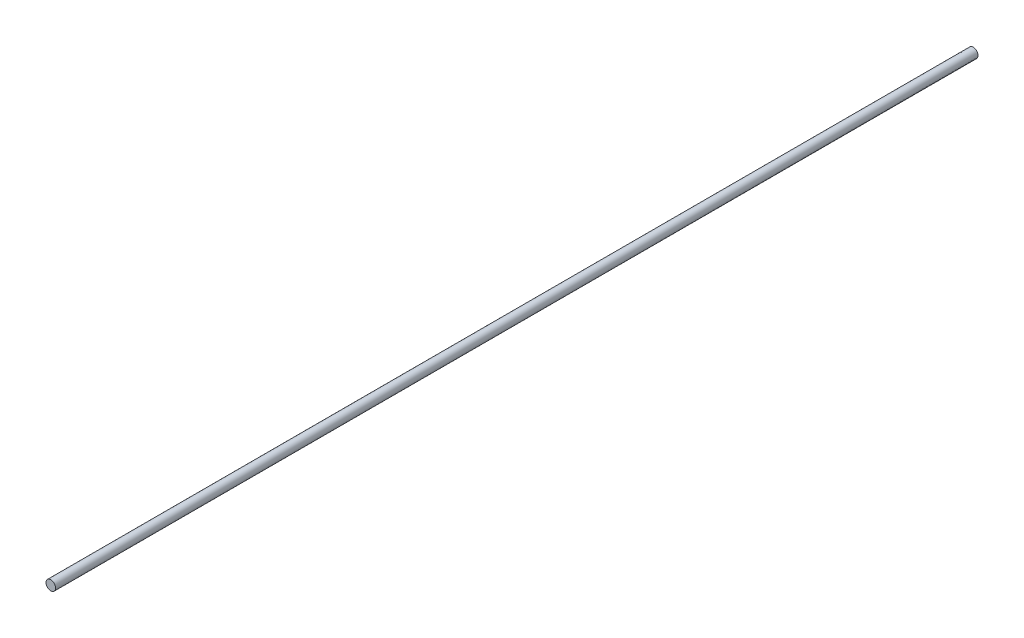
ISO-10303-21;
HEADER;
FILE_DESCRIPTION(('STEP AP214'),'2;1');
FILE_NAME('part.step','',(''),(''),'','','');
FILE_SCHEMA(('AUTOMOTIVE_DESIGN { 1 0 10303 214 1 1 1 1 }'));
ENDSEC;
DATA;
#1=APPLICATION_CONTEXT('core data for automotive mechanical design processes');
#2=APPLICATION_PROTOCOL_DEFINITION('international standard','automotive_design',2000,#1);
#3=PRODUCT_CONTEXT('',#1,'mechanical');
#4=PRODUCT('Part','Part','',(#3));
#5=PRODUCT_RELATED_PRODUCT_CATEGORY('part','',(#4));
#6=PRODUCT_DEFINITION_FORMATION('','',#4);
#7=PRODUCT_DEFINITION_CONTEXT('part definition',#1,'design');
#8=PRODUCT_DEFINITION('design','',#6,#7);
#9=PRODUCT_DEFINITION_SHAPE('','',#8);
#10=(LENGTH_UNIT() NAMED_UNIT(*) SI_UNIT(.MILLI.,.METRE.));
#11=(NAMED_UNIT(*) PLANE_ANGLE_UNIT() SI_UNIT($,.RADIAN.));
#12=(NAMED_UNIT(*) SI_UNIT($,.STERADIAN.) SOLID_ANGLE_UNIT());
#13=UNCERTAINTY_MEASURE_WITH_UNIT(LENGTH_MEASURE(1.E-05),#10,'distance_accuracy_value','');
#14=(GEOMETRIC_REPRESENTATION_CONTEXT(3) GLOBAL_UNCERTAINTY_ASSIGNED_CONTEXT((#13)) GLOBAL_UNIT_ASSIGNED_CONTEXT((#10,
#11,#12)) REPRESENTATION_CONTEXT('',''));
#15=CARTESIAN_POINT('',(0.,0.,0.));
#16=DIRECTION('',(0.,0.,1.));
#17=DIRECTION('',(1.,0.,0.));
#18=AXIS2_PLACEMENT_3D('',#15,#16,#17);
#19=CARTESIAN_POINT('',(0.,0.,1219.2));
#20=DIRECTION('',(0.,0.,-1.));
#21=DIRECTION('',(-1.,0.,0.));
#22=AXIS2_PLACEMENT_3D('',#19,#20,#21);
#23=CYLINDRICAL_SURFACE('',#22,6.35);
#24=CARTESIAN_POINT('',(0.,0.,1219.2));
#25=DIRECTION('',(0.,0.,1.));
#26=DIRECTION('',(1.,0.,0.));
#27=AXIS2_PLACEMENT_3D('',#24,#25,#26);
#28=CIRCLE('',#27,6.35);
#29=CARTESIAN_POINT('',(-6.35,0.,1219.2));
#30=VERTEX_POINT('',#29);
#31=EDGE_CURVE('E10',#30,#30,#28,.T.);
#32=CARTESIAN_POINT('',(0.,0.,0.));
#33=DIRECTION('',(0.,0.,1.));
#34=DIRECTION('',(1.,0.,0.));
#35=AXIS2_PLACEMENT_3D('',#32,#33,#34);
#36=CIRCLE('',#35,6.35);
#37=CARTESIAN_POINT('',(-6.35,0.,0.));
#38=VERTEX_POINT('',#37);
#39=EDGE_CURVE('E37',#38,#38,#36,.T.);
#40=CARTESIAN_POINT('',(-6.35,0.,1219.2));
#41=CARTESIAN_POINT('',(-6.35,0.,1206.5));
#42=CARTESIAN_POINT('',(-6.35,0.,1193.8));
#43=CARTESIAN_POINT('',(-6.35,0.,1168.4));
#44=CARTESIAN_POINT('',(-6.35,0.,1155.7));
#45=CARTESIAN_POINT('',(-6.35,0.,1130.3));
#46=CARTESIAN_POINT('',(-6.35,0.,1117.6));
#47=CARTESIAN_POINT('',(-6.35,0.,1092.2));
#48=CARTESIAN_POINT('',(-6.35,0.,1079.5));
#49=CARTESIAN_POINT('',(-6.35,0.,1054.1));
#50=CARTESIAN_POINT('',(-6.35,0.,1041.4));
#51=CARTESIAN_POINT('',(-6.35,0.,1016.));
#52=CARTESIAN_POINT('',(-6.35,0.,1003.3));
#53=CARTESIAN_POINT('',(-6.35,0.,977.9));
#54=CARTESIAN_POINT('',(-6.35,0.,965.2));
#55=CARTESIAN_POINT('',(-6.35,0.,939.8));
#56=CARTESIAN_POINT('',(-6.35,0.,927.1));
#57=CARTESIAN_POINT('',(-6.35,0.,901.7));
#58=CARTESIAN_POINT('',(-6.35,0.,889.));
#59=CARTESIAN_POINT('',(-6.35,0.,863.6));
#60=CARTESIAN_POINT('',(-6.35,0.,850.9));
#61=CARTESIAN_POINT('',(-6.35,0.,825.5));
#62=CARTESIAN_POINT('',(-6.35,0.,812.8));
#63=CARTESIAN_POINT('',(-6.35,0.,787.4));
#64=CARTESIAN_POINT('',(-6.35,0.,774.7));
#65=CARTESIAN_POINT('',(-6.35,0.,749.3));
#66=CARTESIAN_POINT('',(-6.35,0.,736.6));
#67=CARTESIAN_POINT('',(-6.35,0.,711.2));
#68=CARTESIAN_POINT('',(-6.35,0.,698.5));
#69=CARTESIAN_POINT('',(-6.35,0.,673.1));
#70=CARTESIAN_POINT('',(-6.35,0.,660.4));
#71=CARTESIAN_POINT('',(-6.35,0.,635.));
#72=CARTESIAN_POINT('',(-6.35,0.,622.3));
#73=CARTESIAN_POINT('',(-6.35,0.,596.9));
#74=CARTESIAN_POINT('',(-6.35,0.,584.2));
#75=CARTESIAN_POINT('',(-6.35,0.,558.8));
#76=CARTESIAN_POINT('',(-6.35,0.,546.1));
#77=CARTESIAN_POINT('',(-6.35,0.,520.7));
#78=CARTESIAN_POINT('',(-6.35,0.,508.));
#79=CARTESIAN_POINT('',(-6.35,0.,482.6));
#80=CARTESIAN_POINT('',(-6.35,0.,469.9));
#81=CARTESIAN_POINT('',(-6.35,0.,444.5));
#82=CARTESIAN_POINT('',(-6.35,0.,431.8));
#83=CARTESIAN_POINT('',(-6.35,0.,406.4));
#84=CARTESIAN_POINT('',(-6.35,0.,393.7));
#85=CARTESIAN_POINT('',(-6.35,0.,368.3));
#86=CARTESIAN_POINT('',(-6.35,0.,355.6));
#87=CARTESIAN_POINT('',(-6.35,0.,330.2));
#88=CARTESIAN_POINT('',(-6.35,0.,317.5));
#89=CARTESIAN_POINT('',(-6.35,0.,292.1));
#90=CARTESIAN_POINT('',(-6.35,0.,279.4));
#91=CARTESIAN_POINT('',(-6.35,0.,254.));
#92=CARTESIAN_POINT('',(-6.35,0.,241.3));
#93=CARTESIAN_POINT('',(-6.35,0.,215.9));
#94=CARTESIAN_POINT('',(-6.35,0.,203.2));
#95=CARTESIAN_POINT('',(-6.35,0.,177.8));
#96=CARTESIAN_POINT('',(-6.35,0.,165.1));
#97=CARTESIAN_POINT('',(-6.35,0.,139.7));
#98=CARTESIAN_POINT('',(-6.35,0.,127.));
#99=CARTESIAN_POINT('',(-6.35,0.,101.6));
#100=CARTESIAN_POINT('',(-6.35,0.,88.9));
#101=CARTESIAN_POINT('',(-6.35,0.,63.5));
#102=CARTESIAN_POINT('',(-6.35,0.,50.8));
#103=CARTESIAN_POINT('',(-6.35,0.,25.4));
#104=CARTESIAN_POINT('',(-6.35,0.,12.7));
#105=CARTESIAN_POINT('',(-6.35,0.,0.));
#106=B_SPLINE_CURVE_WITH_KNOTS('',3,(#40,#41,#42,#43,#44,#45,#46,#47,#48,#49,#50,#51,#52,#53,
#54,#55,#56,#57,#58,#59,#60,#61,#62,#63,#64,#65,#66,#67,#68,#69,#70,#71,#72,#73,#74,#75,#76,#77,
#78,#79,#80,#81,#82,#83,#84,#85,#86,#87,#88,#89,#90,#91,#92,#93,#94,#95,#96,#97,#98,#99,#100,
#101,#102,#103,#104,#105),.UNSPECIFIED.,.F.,.F.,(4,2,2,2,2,2,2,2,2,2,2,2,2,2,2,2,2,2,2,2,2,2,2,
2,2,2,2,2,2,2,2,2,4),(0.,38.1,76.2,114.3,152.4,190.5,228.6,266.7,304.8,342.9,381.,419.1,457.2,
495.3,533.4,571.5,609.6,647.7,685.8,723.9,762.,800.1,838.2,876.3,914.4,952.5,990.6,1028.7,
1066.8,1104.9,1143.,1181.1,1219.2),.UNSPECIFIED.);
#107=EDGE_CURVE('BSEAM34',#30,#38,#106,.T.);
#108=ORIENTED_EDGE('',*,*,#31,.F.);
#109=ORIENTED_EDGE('',*,*,#39,.T.);
#110=ORIENTED_EDGE('',*,*,#107,.T.);
#111=ORIENTED_EDGE('',*,*,#107,.F.);
#112=EDGE_LOOP('',(#108,#110,#109,#111));
#113=FACE_BOUND('',#112,.T.);
#114=ADVANCED_FACE('F34',(#113),#23,.T.);
#115=CARTESIAN_POINT('',(0.,0.,1219.2));
#116=DIRECTION('',(0.,0.,1.));
#117=DIRECTION('',(1.,0.,0.));
#118=AXIS2_PLACEMENT_3D('',#115,#116,#117);
#119=PLANE('',#118);
#120=ORIENTED_EDGE('',*,*,#31,.T.);
#121=EDGE_LOOP('',(#120));
#122=FACE_BOUND('',#121,.T.);
#123=ADVANCED_FACE('F49',(#122),#119,.T.);
#124=CARTESIAN_POINT('',(0.,0.,0.));
#125=DIRECTION('',(0.,0.,1.));
#126=DIRECTION('',(1.,0.,0.));
#127=AXIS2_PLACEMENT_3D('',#124,#125,#126);
#128=PLANE('',#127);
#129=ORIENTED_EDGE('',*,*,#39,.F.);
#130=EDGE_LOOP('',(#129));
#131=FACE_BOUND('',#130,.T.);
#132=ADVANCED_FACE('F47',(#131),#128,.F.);
#133=CLOSED_SHELL('',(#114,#123,#132));
#134=MANIFOLD_SOLID_BREP('B2',#133);
#135=ADVANCED_BREP_SHAPE_REPRESENTATION('',(#18,#134),#14);
#136=SHAPE_DEFINITION_REPRESENTATION(#9,#135);
ENDSEC;
END-ISO-10303-21;
